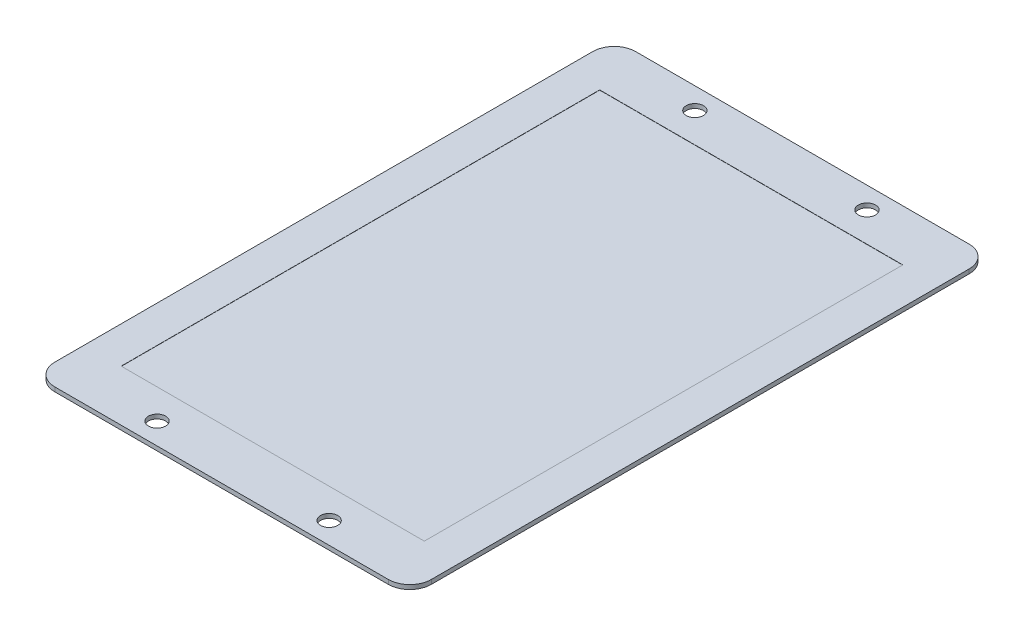
ISO-10303-21;
HEADER;
FILE_DESCRIPTION(('STEP AP214'),'2;1');
FILE_NAME('part.step','',(''),(''),'','','');
FILE_SCHEMA(('AUTOMOTIVE_DESIGN { 1 0 10303 214 1 1 1 1 }'));
ENDSEC;
DATA;
#1=APPLICATION_CONTEXT('core data for automotive mechanical design processes');
#2=APPLICATION_PROTOCOL_DEFINITION('international standard','automotive_design',2000,#1);
#3=PRODUCT_CONTEXT('',#1,'mechanical');
#4=PRODUCT('Part','Part','',(#3));
#5=PRODUCT_RELATED_PRODUCT_CATEGORY('part','',(#4));
#6=PRODUCT_DEFINITION_FORMATION('','',#4);
#7=PRODUCT_DEFINITION_CONTEXT('part definition',#1,'design');
#8=PRODUCT_DEFINITION('design','',#6,#7);
#9=PRODUCT_DEFINITION_SHAPE('','',#8);
#10=(LENGTH_UNIT() NAMED_UNIT(*) SI_UNIT(.MILLI.,.METRE.));
#11=(NAMED_UNIT(*) PLANE_ANGLE_UNIT() SI_UNIT($,.RADIAN.));
#12=(NAMED_UNIT(*) SI_UNIT($,.STERADIAN.) SOLID_ANGLE_UNIT());
#13=UNCERTAINTY_MEASURE_WITH_UNIT(LENGTH_MEASURE(1.E-05),#10,'distance_accuracy_value','');
#14=(GEOMETRIC_REPRESENTATION_CONTEXT(3) GLOBAL_UNCERTAINTY_ASSIGNED_CONTEXT((#13)) GLOBAL_UNIT_ASSIGNED_CONTEXT((#10,
#11,#12)) REPRESENTATION_CONTEXT('',''));
#15=CARTESIAN_POINT('',(0.,0.,0.));
#16=DIRECTION('',(0.,0.,1.));
#17=DIRECTION('',(1.,0.,0.));
#18=AXIS2_PLACEMENT_3D('',#15,#16,#17);
#19=CARTESIAN_POINT('',(0.,0.,0.));
#20=DIRECTION('',(0.,1.,0.));
#21=DIRECTION('',(0.,0.,1.));
#22=AXIS2_PLACEMENT_3D('',#19,#20,#21);
#23=PLANE('',#22);
#24=DIRECTION('',(0.,0.,-1.));
#25=VECTOR('',#24,1.);
#26=CARTESIAN_POINT('',(87.5,0.,-135.));
#27=LINE('',#26,#25);
#28=CARTESIAN_POINT('',(87.5,0.,125.));
#29=VERTEX_POINT('',#28);
#30=CARTESIAN_POINT('',(87.5,0.,-125.));
#31=VERTEX_POINT('',#30);
#32=EDGE_CURVE('E257',#29,#31,#27,.T.);
#33=ORIENTED_EDGE('',*,*,#32,.F.);
#34=CARTESIAN_POINT('',(77.5,0.,125.));
#35=DIRECTION('',(0.,1.,0.));
#36=DIRECTION('',(0.,0.,1.));
#37=AXIS2_PLACEMENT_3D('',#34,#35,#36);
#38=CIRCLE('',#37,10.);
#39=CARTESIAN_POINT('',(77.5,0.,135.));
#40=VERTEX_POINT('',#39);
#41=EDGE_CURVE('E294',#29,#40,#38,.F.);
#42=ORIENTED_EDGE('',*,*,#41,.T.);
#43=DIRECTION('',(1.,0.,0.));
#44=VECTOR('',#43,1.);
#45=CARTESIAN_POINT('',(-87.5,0.,135.));
#46=LINE('',#45,#44);
#47=CARTESIAN_POINT('',(-77.5,0.,135.));
#48=VERTEX_POINT('',#47);
#49=EDGE_CURVE('E264',#48,#40,#46,.T.);
#50=ORIENTED_EDGE('',*,*,#49,.F.);
#51=CARTESIAN_POINT('',(-77.5,0.,125.));
#52=DIRECTION('',(0.,1.,0.));
#53=DIRECTION('',(0.,0.,1.));
#54=AXIS2_PLACEMENT_3D('',#51,#52,#53);
#55=CIRCLE('',#54,10.);
#56=CARTESIAN_POINT('',(-87.5,0.,125.));
#57=VERTEX_POINT('',#56);
#58=EDGE_CURVE('E288',#48,#57,#55,.F.);
#59=ORIENTED_EDGE('',*,*,#58,.T.);
#60=DIRECTION('',(0.,0.,1.));
#61=VECTOR('',#60,1.);
#62=CARTESIAN_POINT('',(-87.5,0.,-135.));
#63=LINE('',#62,#61);
#64=CARTESIAN_POINT('',(-87.5,0.,-125.));
#65=VERTEX_POINT('',#64);
#66=EDGE_CURVE('E279',#65,#57,#63,.T.);
#67=ORIENTED_EDGE('',*,*,#66,.F.);
#68=CARTESIAN_POINT('',(-77.5,0.,-125.));
#69=DIRECTION('',(0.,1.,0.));
#70=DIRECTION('',(0.,0.,1.));
#71=AXIS2_PLACEMENT_3D('',#68,#69,#70);
#72=CIRCLE('',#71,10.);
#73=CARTESIAN_POINT('',(-77.5,0.,-135.));
#74=VERTEX_POINT('',#73);
#75=EDGE_CURVE('E292',#65,#74,#72,.F.);
#76=ORIENTED_EDGE('',*,*,#75,.T.);
#77=DIRECTION('',(-1.,0.,0.));
#78=VECTOR('',#77,1.);
#79=CARTESIAN_POINT('',(-87.5,0.,-135.));
#80=LINE('',#79,#78);
#81=CARTESIAN_POINT('',(77.5,0.,-135.));
#82=VERTEX_POINT('',#81);
#83=EDGE_CURVE('E276',#82,#74,#80,.T.);
#84=ORIENTED_EDGE('',*,*,#83,.F.);
#85=CARTESIAN_POINT('',(77.5,0.,-125.));
#86=DIRECTION('',(0.,1.,0.));
#87=DIRECTION('',(0.,0.,1.));
#88=AXIS2_PLACEMENT_3D('',#85,#86,#87);
#89=CIRCLE('',#88,10.);
#90=EDGE_CURVE('E290',#82,#31,#89,.F.);
#91=ORIENTED_EDGE('',*,*,#90,.T.);
#92=EDGE_LOOP('',(#33,#42,#50,#59,#67,#76,#84,#91));
#93=FACE_BOUND('',#92,.T.);
#94=CARTESIAN_POINT('',(-40.,0.,-125.));
#95=DIRECTION('',(0.,1.,0.));
#96=DIRECTION('',(0.,0.,1.));
#97=AXIS2_PLACEMENT_3D('',#94,#95,#96);
#98=CIRCLE('',#97,4.);
#99=CARTESIAN_POINT('',(-40.,0.,-121.));
#100=VERTEX_POINT('',#99);
#101=EDGE_CURVE('E254',#100,#100,#98,.T.);
#102=ORIENTED_EDGE('',*,*,#101,.T.);
#103=EDGE_LOOP('',(#102));
#104=FACE_BOUND('',#103,.T.);
#105=CARTESIAN_POINT('',(40.,0.,-125.));
#106=DIRECTION('',(0.,1.,0.));
#107=DIRECTION('',(0.,0.,1.));
#108=AXIS2_PLACEMENT_3D('',#105,#106,#107);
#109=CIRCLE('',#108,4.);
#110=CARTESIAN_POINT('',(40.,0.,-121.));
#111=VERTEX_POINT('',#110);
#112=EDGE_CURVE('E236',#111,#111,#109,.T.);
#113=ORIENTED_EDGE('',*,*,#112,.T.);
#114=EDGE_LOOP('',(#113));
#115=FACE_BOUND('',#114,.T.);
#116=CARTESIAN_POINT('',(40.,0.,125.));
#117=DIRECTION('',(0.,1.,0.));
#118=DIRECTION('',(0.,0.,1.));
#119=AXIS2_PLACEMENT_3D('',#116,#117,#118);
#120=CIRCLE('',#119,4.00000000000001);
#121=CARTESIAN_POINT('',(40.,0.,129.));
#122=VERTEX_POINT('',#121);
#123=EDGE_CURVE('E243',#122,#122,#120,.T.);
#124=ORIENTED_EDGE('',*,*,#123,.T.);
#125=EDGE_LOOP('',(#124));
#126=FACE_BOUND('',#125,.T.);
#127=CARTESIAN_POINT('',(-40.,0.,125.));
#128=DIRECTION('',(0.,1.,0.));
#129=DIRECTION('',(0.,0.,1.));
#130=AXIS2_PLACEMENT_3D('',#127,#128,#129);
#131=CIRCLE('',#130,4.);
#132=CARTESIAN_POINT('',(-40.,0.,129.));
#133=VERTEX_POINT('',#132);
#134=EDGE_CURVE('E249',#133,#133,#131,.T.);
#135=ORIENTED_EDGE('',*,*,#134,.T.);
#136=EDGE_LOOP('',(#135));
#137=FACE_BOUND('',#136,.T.);
#138=DIRECTION('',(0.,0.,-1.));
#139=VECTOR('',#138,1.);
#140=CARTESIAN_POINT('',(-2.5,0.,-20.));
#141=LINE('',#140,#139);
#142=CARTESIAN_POINT('',(-2.5,0.,18.));
#143=VERTEX_POINT('',#142);
#144=CARTESIAN_POINT('',(-2.5,0.,-18.));
#145=VERTEX_POINT('',#144);
#146=EDGE_CURVE('E389',#143,#145,#141,.T.);
#147=ORIENTED_EDGE('',*,*,#146,.F.);
#148=CARTESIAN_POINT('',(-0.500000000000002,0.,18.));
#149=DIRECTION('',(0.,1.,0.));
#150=DIRECTION('',(0.,0.,1.));
#151=AXIS2_PLACEMENT_3D('',#148,#149,#150);
#152=CIRCLE('',#151,2.);
#153=CARTESIAN_POINT('',(-0.499999999999987,0.,20.));
#154=VERTEX_POINT('',#153);
#155=EDGE_CURVE('E353',#143,#154,#152,.T.);
#156=ORIENTED_EDGE('',*,*,#155,.T.);
#157=DIRECTION('',(-1.,0.,0.));
#158=VECTOR('',#157,1.);
#159=CARTESIAN_POINT('',(42.5,0.,20.));
#160=LINE('',#159,#158);
#161=CARTESIAN_POINT('',(40.5,0.,20.));
#162=VERTEX_POINT('',#161);
#163=EDGE_CURVE('E220',#162,#154,#160,.T.);
#164=ORIENTED_EDGE('',*,*,#163,.F.);
#165=CARTESIAN_POINT('',(40.5,0.,18.));
#166=DIRECTION('',(0.,1.,0.));
#167=DIRECTION('',(0.,0.,1.));
#168=AXIS2_PLACEMENT_3D('',#165,#166,#167);
#169=CIRCLE('',#168,2.);
#170=CARTESIAN_POINT('',(42.5,0.,18.));
#171=VERTEX_POINT('',#170);
#172=EDGE_CURVE('E351',#162,#171,#169,.T.);
#173=ORIENTED_EDGE('',*,*,#172,.T.);
#174=DIRECTION('',(0.,0.,1.));
#175=VECTOR('',#174,1.);
#176=CARTESIAN_POINT('',(42.5,0.,-20.));
#177=LINE('',#176,#175);
#178=CARTESIAN_POINT('',(42.5,0.,-18.));
#179=VERTEX_POINT('',#178);
#180=EDGE_CURVE('E395',#179,#171,#177,.T.);
#181=ORIENTED_EDGE('',*,*,#180,.F.);
#182=CARTESIAN_POINT('',(40.5,0.,-18.));
#183=DIRECTION('',(0.,1.,0.));
#184=DIRECTION('',(0.,0.,1.));
#185=AXIS2_PLACEMENT_3D('',#182,#183,#184);
#186=CIRCLE('',#185,2.);
#187=CARTESIAN_POINT('',(40.5,0.,-20.));
#188=VERTEX_POINT('',#187);
#189=EDGE_CURVE('E49',#179,#188,#186,.T.);
#190=ORIENTED_EDGE('',*,*,#189,.T.);
#191=DIRECTION('',(1.,0.,0.));
#192=VECTOR('',#191,1.);
#193=CARTESIAN_POINT('',(42.5,0.,-20.));
#194=LINE('',#193,#192);
#195=CARTESIAN_POINT('',(-0.499999999999987,0.,-20.));
#196=VERTEX_POINT('',#195);
#197=EDGE_CURVE('E391',#196,#188,#194,.T.);
#198=ORIENTED_EDGE('',*,*,#197,.F.);
#199=CARTESIAN_POINT('',(-0.5,0.,-18.));
#200=DIRECTION('',(0.,1.,0.));
#201=DIRECTION('',(0.,0.,1.));
#202=AXIS2_PLACEMENT_3D('',#199,#200,#201);
#203=CIRCLE('',#202,2.);
#204=EDGE_CURVE('E11',#196,#145,#203,.T.);
#205=ORIENTED_EDGE('',*,*,#204,.T.);
#206=EDGE_LOOP('',(#147,#156,#164,#173,#181,#190,#198,#205));
#207=FACE_BOUND('',#206,.T.);
#208=ADVANCED_FACE('F40',(#93,#104,#115,#126,#137,#207),#23,.F.);
#209=CARTESIAN_POINT('',(87.5,2.,-135.));
#210=DIRECTION('',(-1.,0.,0.));
#211=DIRECTION('',(0.,0.,1.));
#212=AXIS2_PLACEMENT_3D('',#209,#210,#211);
#213=PLANE('',#212);
#214=DIRECTION('',(0.,0.,-1.));
#215=VECTOR('',#214,1.);
#216=CARTESIAN_POINT('',(87.5,2.,-135.));
#217=LINE('',#216,#215);
#218=CARTESIAN_POINT('',(87.5,2.,125.));
#219=VERTEX_POINT('',#218);
#220=CARTESIAN_POINT('',(87.5,2.,-125.));
#221=VERTEX_POINT('',#220);
#222=EDGE_CURVE('E260',#219,#221,#217,.T.);
#223=ORIENTED_EDGE('',*,*,#222,.F.);
#224=DIRECTION('',(0.,-1.,0.));
#225=VECTOR('',#224,1.);
#226=CARTESIAN_POINT('',(87.5,2.,125.));
#227=LINE('',#226,#225);
#228=EDGE_CURVE('E285',#219,#29,#227,.T.);
#229=ORIENTED_EDGE('',*,*,#228,.T.);
#230=ORIENTED_EDGE('',*,*,#32,.T.);
#231=DIRECTION('',(0.,-1.,0.));
#232=VECTOR('',#231,1.);
#233=CARTESIAN_POINT('',(87.5,2.,-125.));
#234=LINE('',#233,#232);
#235=EDGE_CURVE('E273',#31,#221,#234,.F.);
#236=ORIENTED_EDGE('',*,*,#235,.T.);
#237=EDGE_LOOP('',(#223,#229,#230,#236));
#238=FACE_BOUND('',#237,.T.);
#239=ADVANCED_FACE('F465',(#238),#213,.F.);
#240=CARTESIAN_POINT('',(-87.5,2.,-135.));
#241=DIRECTION('',(0.,0.,1.));
#242=DIRECTION('',(1.,0.,0.));
#243=AXIS2_PLACEMENT_3D('',#240,#241,#242);
#244=PLANE('',#243);
#245=ORIENTED_EDGE('',*,*,#83,.T.);
#246=DIRECTION('',(0.,-1.,0.));
#247=VECTOR('',#246,1.);
#248=CARTESIAN_POINT('',(-77.5,2.,-135.));
#249=LINE('',#248,#247);
#250=CARTESIAN_POINT('',(-77.5,2.,-135.));
#251=VERTEX_POINT('',#250);
#252=EDGE_CURVE('E317',#74,#251,#249,.F.);
#253=ORIENTED_EDGE('',*,*,#252,.T.);
#254=DIRECTION('',(-1.,0.,0.));
#255=VECTOR('',#254,1.);
#256=CARTESIAN_POINT('',(-87.5,2.,-135.));
#257=LINE('',#256,#255);
#258=CARTESIAN_POINT('',(77.5,2.,-135.));
#259=VERTEX_POINT('',#258);
#260=EDGE_CURVE('E263',#259,#251,#257,.T.);
#261=ORIENTED_EDGE('',*,*,#260,.F.);
#262=DIRECTION('',(0.,-1.,0.));
#263=VECTOR('',#262,1.);
#264=CARTESIAN_POINT('',(77.5,2.,-135.));
#265=LINE('',#264,#263);
#266=EDGE_CURVE('E314',#259,#82,#265,.T.);
#267=ORIENTED_EDGE('',*,*,#266,.T.);
#268=EDGE_LOOP('',(#245,#253,#261,#267));
#269=FACE_BOUND('',#268,.T.);
#270=ADVANCED_FACE('F471',(#269),#244,.F.);
#271=CARTESIAN_POINT('',(-87.5,2.,-135.));
#272=DIRECTION('',(1.,0.,0.));
#273=DIRECTION('',(0.,0.,-1.));
#274=AXIS2_PLACEMENT_3D('',#271,#272,#273);
#275=PLANE('',#274);
#276=DIRECTION('',(0.,0.,1.));
#277=VECTOR('',#276,1.);
#278=CARTESIAN_POINT('',(-87.5,2.,-135.));
#279=LINE('',#278,#277);
#280=CARTESIAN_POINT('',(-87.5,2.,-125.));
#281=VERTEX_POINT('',#280);
#282=CARTESIAN_POINT('',(-87.5,2.,125.));
#283=VERTEX_POINT('',#282);
#284=EDGE_CURVE('E267',#281,#283,#279,.T.);
#285=ORIENTED_EDGE('',*,*,#284,.F.);
#286=DIRECTION('',(0.,-1.,0.));
#287=VECTOR('',#286,1.);
#288=CARTESIAN_POINT('',(-87.5,2.,-125.));
#289=LINE('',#288,#287);
#290=EDGE_CURVE('E311',#281,#65,#289,.T.);
#291=ORIENTED_EDGE('',*,*,#290,.T.);
#292=ORIENTED_EDGE('',*,*,#66,.T.);
#293=DIRECTION('',(0.,-1.,0.));
#294=VECTOR('',#293,1.);
#295=CARTESIAN_POINT('',(-87.5,2.,125.));
#296=LINE('',#295,#294);
#297=EDGE_CURVE('E309',#57,#283,#296,.F.);
#298=ORIENTED_EDGE('',*,*,#297,.T.);
#299=EDGE_LOOP('',(#285,#291,#292,#298));
#300=FACE_BOUND('',#299,.T.);
#301=ADVANCED_FACE('F483',(#300),#275,.F.);
#302=CARTESIAN_POINT('',(-87.5,2.,135.));
#303=DIRECTION('',(0.,0.,-1.));
#304=DIRECTION('',(-1.,0.,0.));
#305=AXIS2_PLACEMENT_3D('',#302,#303,#304);
#306=PLANE('',#305);
#307=ORIENTED_EDGE('',*,*,#49,.T.);
#308=DIRECTION('',(0.,-1.,0.));
#309=VECTOR('',#308,1.);
#310=CARTESIAN_POINT('',(77.5,2.,135.));
#311=LINE('',#310,#309);
#312=CARTESIAN_POINT('',(77.5,2.,135.));
#313=VERTEX_POINT('',#312);
#314=EDGE_CURVE('E299',#40,#313,#311,.F.);
#315=ORIENTED_EDGE('',*,*,#314,.T.);
#316=DIRECTION('',(1.,0.,0.));
#317=VECTOR('',#316,1.);
#318=CARTESIAN_POINT('',(-87.5,2.,135.));
#319=LINE('',#318,#317);
#320=CARTESIAN_POINT('',(-77.5,2.,135.));
#321=VERTEX_POINT('',#320);
#322=EDGE_CURVE('E270',#321,#313,#319,.T.);
#323=ORIENTED_EDGE('',*,*,#322,.F.);
#324=DIRECTION('',(0.,-1.,0.));
#325=VECTOR('',#324,1.);
#326=CARTESIAN_POINT('',(-77.5,2.,135.));
#327=LINE('',#326,#325);
#328=EDGE_CURVE('E296',#321,#48,#327,.T.);
#329=ORIENTED_EDGE('',*,*,#328,.T.);
#330=EDGE_LOOP('',(#307,#315,#323,#329));
#331=FACE_BOUND('',#330,.T.);
#332=ADVANCED_FACE('F480',(#331),#306,.F.);
#333=CARTESIAN_POINT('',(0.,2.,0.));
#334=DIRECTION('',(0.,1.,0.));
#335=DIRECTION('',(0.,0.,1.));
#336=AXIS2_PLACEMENT_3D('',#333,#334,#335);
#337=PLANE('',#336);
#338=DIRECTION('',(0.,0.,-1.));
#339=VECTOR('',#338,1.);
#340=CARTESIAN_POINT('',(70.4533735657283,2.,-111.208912534244));
#341=LINE('',#340,#339);
#342=CARTESIAN_POINT('',(70.4533735657283,2.,111.208912534244));
#343=VERTEX_POINT('',#342);
#344=CARTESIAN_POINT('',(70.4533735657283,2.,-111.208912534244));
#345=VERTEX_POINT('',#344);
#346=EDGE_CURVE('E197',#343,#345,#341,.T.);
#347=ORIENTED_EDGE('',*,*,#346,.F.);
#348=DIRECTION('',(1.,0.,0.));
#349=VECTOR('',#348,1.);
#350=CARTESIAN_POINT('',(-70.4533735657283,2.,111.208912534244));
#351=LINE('',#350,#349);
#352=CARTESIAN_POINT('',(-70.4533735657283,2.,111.208912534244));
#353=VERTEX_POINT('',#352);
#354=EDGE_CURVE('E214',#353,#343,#351,.T.);
#355=ORIENTED_EDGE('',*,*,#354,.F.);
#356=DIRECTION('',(0.,0.,1.));
#357=VECTOR('',#356,1.);
#358=CARTESIAN_POINT('',(-70.4533735657283,2.,-111.208912534244));
#359=LINE('',#358,#357);
#360=CARTESIAN_POINT('',(-70.4533735657283,2.,-111.208912534244));
#361=VERTEX_POINT('',#360);
#362=EDGE_CURVE('E217',#361,#353,#359,.T.);
#363=ORIENTED_EDGE('',*,*,#362,.F.);
#364=DIRECTION('',(-1.,0.,0.));
#365=VECTOR('',#364,1.);
#366=CARTESIAN_POINT('',(-70.4533735657283,2.,-111.208912534244));
#367=LINE('',#366,#365);
#368=EDGE_CURVE('E226',#345,#361,#367,.T.);
#369=ORIENTED_EDGE('',*,*,#368,.F.);
#370=EDGE_LOOP('',(#347,#355,#363,#369));
#371=FACE_BOUND('',#370,.T.);
#372=CARTESIAN_POINT('',(-40.,2.,125.));
#373=DIRECTION('',(0.,1.,0.));
#374=DIRECTION('',(0.,0.,1.));
#375=AXIS2_PLACEMENT_3D('',#372,#373,#374);
#376=CIRCLE('',#375,4.);
#377=CARTESIAN_POINT('',(-40.,2.,129.));
#378=VERTEX_POINT('',#377);
#379=EDGE_CURVE('E232',#378,#378,#376,.T.);
#380=ORIENTED_EDGE('',*,*,#379,.F.);
#381=EDGE_LOOP('',(#380));
#382=FACE_BOUND('',#381,.T.);
#383=CARTESIAN_POINT('',(40.,2.,125.));
#384=DIRECTION('',(0.,1.,0.));
#385=DIRECTION('',(0.,0.,1.));
#386=AXIS2_PLACEMENT_3D('',#383,#384,#385);
#387=CIRCLE('',#386,4.00000000000001);
#388=CARTESIAN_POINT('',(40.,2.,129.));
#389=VERTEX_POINT('',#388);
#390=EDGE_CURVE('E246',#389,#389,#387,.T.);
#391=ORIENTED_EDGE('',*,*,#390,.F.);
#392=EDGE_LOOP('',(#391));
#393=FACE_BOUND('',#392,.T.);
#394=CARTESIAN_POINT('',(40.,2.,-125.));
#395=DIRECTION('',(0.,1.,0.));
#396=DIRECTION('',(0.,0.,1.));
#397=AXIS2_PLACEMENT_3D('',#394,#395,#396);
#398=CIRCLE('',#397,4.);
#399=CARTESIAN_POINT('',(40.,2.,-121.));
#400=VERTEX_POINT('',#399);
#401=EDGE_CURVE('E240',#400,#400,#398,.T.);
#402=ORIENTED_EDGE('',*,*,#401,.F.);
#403=EDGE_LOOP('',(#402));
#404=FACE_BOUND('',#403,.T.);
#405=CARTESIAN_POINT('',(-40.,2.,-125.));
#406=DIRECTION('',(0.,1.,0.));
#407=DIRECTION('',(0.,0.,1.));
#408=AXIS2_PLACEMENT_3D('',#405,#406,#407);
#409=CIRCLE('',#408,4.);
#410=CARTESIAN_POINT('',(-40.,2.,-121.));
#411=VERTEX_POINT('',#410);
#412=EDGE_CURVE('E239',#411,#411,#409,.T.);
#413=ORIENTED_EDGE('',*,*,#412,.F.);
#414=EDGE_LOOP('',(#413));
#415=FACE_BOUND('',#414,.T.);
#416=ORIENTED_EDGE('',*,*,#322,.T.);
#417=CARTESIAN_POINT('',(77.5,2.,125.));
#418=DIRECTION('',(0.,1.,0.));
#419=DIRECTION('',(0.,0.,1.));
#420=AXIS2_PLACEMENT_3D('',#417,#418,#419);
#421=CIRCLE('',#420,10.);
#422=EDGE_CURVE('E307',#313,#219,#421,.T.);
#423=ORIENTED_EDGE('',*,*,#422,.T.);
#424=ORIENTED_EDGE('',*,*,#222,.T.);
#425=CARTESIAN_POINT('',(77.5,2.,-125.));
#426=DIRECTION('',(0.,1.,0.));
#427=DIRECTION('',(0.,0.,1.));
#428=AXIS2_PLACEMENT_3D('',#425,#426,#427);
#429=CIRCLE('',#428,10.);
#430=EDGE_CURVE('E303',#221,#259,#429,.T.);
#431=ORIENTED_EDGE('',*,*,#430,.T.);
#432=ORIENTED_EDGE('',*,*,#260,.T.);
#433=CARTESIAN_POINT('',(-77.5,2.,-125.));
#434=DIRECTION('',(0.,1.,0.));
#435=DIRECTION('',(0.,0.,1.));
#436=AXIS2_PLACEMENT_3D('',#433,#434,#435);
#437=CIRCLE('',#436,10.);
#438=EDGE_CURVE('E305',#251,#281,#437,.T.);
#439=ORIENTED_EDGE('',*,*,#438,.T.);
#440=ORIENTED_EDGE('',*,*,#284,.T.);
#441=CARTESIAN_POINT('',(-77.5,2.,125.));
#442=DIRECTION('',(0.,1.,0.));
#443=DIRECTION('',(0.,0.,1.));
#444=AXIS2_PLACEMENT_3D('',#441,#442,#443);
#445=CIRCLE('',#444,10.);
#446=EDGE_CURVE('E301',#283,#321,#445,.T.);
#447=ORIENTED_EDGE('',*,*,#446,.T.);
#448=EDGE_LOOP('',(#416,#423,#424,#431,#432,#439,#440,#447));
#449=FACE_BOUND('',#448,.T.);
#450=ADVANCED_FACE('F478',(#371,#382,#393,#404,#415,#449),#337,.T.);
#451=CARTESIAN_POINT('',(77.5,2.,125.));
#452=DIRECTION('',(0.,-1.,0.));
#453=DIRECTION('',(0.,0.,-1.));
#454=AXIS2_PLACEMENT_3D('',#451,#452,#453);
#455=CYLINDRICAL_SURFACE('',#454,10.);
#456=ORIENTED_EDGE('',*,*,#422,.F.);
#457=ORIENTED_EDGE('',*,*,#314,.F.);
#458=ORIENTED_EDGE('',*,*,#41,.F.);
#459=ORIENTED_EDGE('',*,*,#228,.F.);
#460=EDGE_LOOP('',(#456,#457,#458,#459));
#461=FACE_BOUND('',#460,.T.);
#462=ADVANCED_FACE('F491',(#461),#455,.T.);
#463=CARTESIAN_POINT('',(-77.5,2.,-125.));
#464=DIRECTION('',(0.,-1.,0.));
#465=DIRECTION('',(0.,0.,-1.));
#466=AXIS2_PLACEMENT_3D('',#463,#464,#465);
#467=CYLINDRICAL_SURFACE('',#466,10.);
#468=ORIENTED_EDGE('',*,*,#438,.F.);
#469=ORIENTED_EDGE('',*,*,#252,.F.);
#470=ORIENTED_EDGE('',*,*,#75,.F.);
#471=ORIENTED_EDGE('',*,*,#290,.F.);
#472=EDGE_LOOP('',(#468,#469,#470,#471));
#473=FACE_BOUND('',#472,.T.);
#474=ADVANCED_FACE('F494',(#473),#467,.T.);
#475=CARTESIAN_POINT('',(77.5,2.,-125.));
#476=DIRECTION('',(0.,-1.,0.));
#477=DIRECTION('',(0.,0.,-1.));
#478=AXIS2_PLACEMENT_3D('',#475,#476,#477);
#479=CYLINDRICAL_SURFACE('',#478,10.);
#480=ORIENTED_EDGE('',*,*,#430,.F.);
#481=ORIENTED_EDGE('',*,*,#235,.F.);
#482=ORIENTED_EDGE('',*,*,#90,.F.);
#483=ORIENTED_EDGE('',*,*,#266,.F.);
#484=EDGE_LOOP('',(#480,#481,#482,#483));
#485=FACE_BOUND('',#484,.T.);
#486=ADVANCED_FACE('F498',(#485),#479,.T.);
#487=CARTESIAN_POINT('',(-77.5,2.,125.));
#488=DIRECTION('',(0.,-1.,0.));
#489=DIRECTION('',(0.,0.,-1.));
#490=AXIS2_PLACEMENT_3D('',#487,#488,#489);
#491=CYLINDRICAL_SURFACE('',#490,10.);
#492=ORIENTED_EDGE('',*,*,#446,.F.);
#493=ORIENTED_EDGE('',*,*,#297,.F.);
#494=ORIENTED_EDGE('',*,*,#58,.F.);
#495=ORIENTED_EDGE('',*,*,#328,.F.);
#496=EDGE_LOOP('',(#492,#493,#494,#495));
#497=FACE_BOUND('',#496,.T.);
#498=ADVANCED_FACE('F502',(#497),#491,.T.);
#499=CARTESIAN_POINT('',(-40.,0.,-125.));
#500=DIRECTION('',(0.,1.,0.));
#501=DIRECTION('',(0.,0.,1.));
#502=AXIS2_PLACEMENT_3D('',#499,#500,#501);
#503=CYLINDRICAL_SURFACE('',#502,4.);
#504=ORIENTED_EDGE('',*,*,#101,.F.);
#505=EDGE_LOOP('',(#504));
#506=FACE_BOUND('',#505,.T.);
#507=ORIENTED_EDGE('',*,*,#412,.T.);
#508=EDGE_LOOP('',(#507));
#509=FACE_BOUND('',#508,.T.);
#510=ADVANCED_FACE('F506',(#506,#509),#503,.F.);
#511=CARTESIAN_POINT('',(40.,0.,-125.));
#512=DIRECTION('',(0.,1.,0.));
#513=DIRECTION('',(0.,0.,1.));
#514=AXIS2_PLACEMENT_3D('',#511,#512,#513);
#515=CYLINDRICAL_SURFACE('',#514,4.);
#516=ORIENTED_EDGE('',*,*,#112,.F.);
#517=EDGE_LOOP('',(#516));
#518=FACE_BOUND('',#517,.T.);
#519=ORIENTED_EDGE('',*,*,#401,.T.);
#520=EDGE_LOOP('',(#519));
#521=FACE_BOUND('',#520,.T.);
#522=ADVANCED_FACE('F690',(#518,#521),#515,.F.);
#523=CARTESIAN_POINT('',(40.,0.,125.));
#524=DIRECTION('',(0.,1.,0.));
#525=DIRECTION('',(0.,0.,1.));
#526=AXIS2_PLACEMENT_3D('',#523,#524,#525);
#527=CYLINDRICAL_SURFACE('',#526,4.00000000000001);
#528=ORIENTED_EDGE('',*,*,#123,.F.);
#529=EDGE_LOOP('',(#528));
#530=FACE_BOUND('',#529,.T.);
#531=ORIENTED_EDGE('',*,*,#390,.T.);
#532=EDGE_LOOP('',(#531));
#533=FACE_BOUND('',#532,.T.);
#534=ADVANCED_FACE('F681',(#530,#533),#527,.F.);
#535=CARTESIAN_POINT('',(-40.,0.,125.));
#536=DIRECTION('',(0.,1.,0.));
#537=DIRECTION('',(0.,0.,1.));
#538=AXIS2_PLACEMENT_3D('',#535,#536,#537);
#539=CYLINDRICAL_SURFACE('',#538,4.);
#540=ORIENTED_EDGE('',*,*,#134,.F.);
#541=EDGE_LOOP('',(#540));
#542=FACE_BOUND('',#541,.T.);
#543=ORIENTED_EDGE('',*,*,#379,.T.);
#544=EDGE_LOOP('',(#543));
#545=FACE_BOUND('',#544,.T.);
#546=ADVANCED_FACE('F672',(#542,#545),#539,.F.);
#547=CARTESIAN_POINT('',(70.4533735657283,1.9,-111.208912534244));
#548=DIRECTION('',(1.,0.,0.));
#549=DIRECTION('',(0.,0.,-1.));
#550=AXIS2_PLACEMENT_3D('',#547,#548,#549);
#551=PLANE('',#550);
#552=ORIENTED_EDGE('',*,*,#346,.T.);
#553=DIRECTION('',(0.,1.,0.));
#554=VECTOR('',#553,1.);
#555=CARTESIAN_POINT('',(70.4533735657283,1.9,-111.208912534244));
#556=LINE('',#555,#554);
#557=CARTESIAN_POINT('',(70.4533735657283,1.9,-111.208912534244));
#558=VERTEX_POINT('',#557);
#559=EDGE_CURVE('E190',#558,#345,#556,.T.);
#560=ORIENTED_EDGE('',*,*,#559,.F.);
#561=DIRECTION('',(0.,0.,-1.));
#562=VECTOR('',#561,1.);
#563=CARTESIAN_POINT('',(70.4533735657283,1.9,-111.208912534244));
#564=LINE('',#563,#562);
#565=CARTESIAN_POINT('',(70.4533735657283,1.9,111.208912534244));
#566=VERTEX_POINT('',#565);
#567=EDGE_CURVE('E194',#566,#558,#564,.T.);
#568=ORIENTED_EDGE('',*,*,#567,.F.);
#569=DIRECTION('',(0.,1.,0.));
#570=VECTOR('',#569,1.);
#571=CARTESIAN_POINT('',(70.4533735657283,1.9,111.208912534244));
#572=LINE('',#571,#570);
#573=EDGE_CURVE('E230',#566,#343,#572,.T.);
#574=ORIENTED_EDGE('',*,*,#573,.T.);
#575=EDGE_LOOP('',(#552,#560,#568,#574));
#576=FACE_BOUND('',#575,.T.);
#577=ADVANCED_FACE('F192',(#576),#551,.F.);
#578=CARTESIAN_POINT('',(-70.4533735657283,1.9,111.208912534244));
#579=DIRECTION('',(0.,0.,1.));
#580=DIRECTION('',(1.,0.,0.));
#581=AXIS2_PLACEMENT_3D('',#578,#579,#580);
#582=PLANE('',#581);
#583=ORIENTED_EDGE('',*,*,#354,.T.);
#584=ORIENTED_EDGE('',*,*,#573,.F.);
#585=DIRECTION('',(1.,0.,0.));
#586=VECTOR('',#585,1.);
#587=CARTESIAN_POINT('',(-70.4533735657283,1.9,111.208912534244));
#588=LINE('',#587,#586);
#589=CARTESIAN_POINT('',(-70.4533735657283,1.9,111.208912534244));
#590=VERTEX_POINT('',#589);
#591=EDGE_CURVE('E202',#590,#566,#588,.T.);
#592=ORIENTED_EDGE('',*,*,#591,.F.);
#593=DIRECTION('',(0.,1.,0.));
#594=VECTOR('',#593,1.);
#595=CARTESIAN_POINT('',(-70.4533735657283,1.9,111.208912534244));
#596=LINE('',#595,#594);
#597=EDGE_CURVE('E233',#590,#353,#596,.T.);
#598=ORIENTED_EDGE('',*,*,#597,.T.);
#599=EDGE_LOOP('',(#583,#584,#592,#598));
#600=FACE_BOUND('',#599,.T.);
#601=ADVANCED_FACE('F655',(#600),#582,.F.);
#602=CARTESIAN_POINT('',(-70.4533735657283,1.9,-111.208912534244));
#603=DIRECTION('',(-1.,0.,0.));
#604=DIRECTION('',(0.,0.,1.));
#605=AXIS2_PLACEMENT_3D('',#602,#603,#604);
#606=PLANE('',#605);
#607=ORIENTED_EDGE('',*,*,#362,.T.);
#608=ORIENTED_EDGE('',*,*,#597,.F.);
#609=DIRECTION('',(0.,0.,1.));
#610=VECTOR('',#609,1.);
#611=CARTESIAN_POINT('',(-70.4533735657283,1.9,-111.208912534244));
#612=LINE('',#611,#610);
#613=CARTESIAN_POINT('',(-70.4533735657283,1.9,-111.208912534244));
#614=VERTEX_POINT('',#613);
#615=EDGE_CURVE('E210',#614,#590,#612,.T.);
#616=ORIENTED_EDGE('',*,*,#615,.F.);
#617=DIRECTION('',(0.,1.,0.));
#618=VECTOR('',#617,1.);
#619=CARTESIAN_POINT('',(-70.4533735657283,1.9,-111.208912534244));
#620=LINE('',#619,#618);
#621=EDGE_CURVE('E201',#614,#361,#620,.T.);
#622=ORIENTED_EDGE('',*,*,#621,.T.);
#623=EDGE_LOOP('',(#607,#608,#616,#622));
#624=FACE_BOUND('',#623,.T.);
#625=ADVANCED_FACE('F647',(#624),#606,.F.);
#626=CARTESIAN_POINT('',(-70.4533735657283,1.9,-111.208912534244));
#627=DIRECTION('',(0.,0.,-1.));
#628=DIRECTION('',(-1.,0.,0.));
#629=AXIS2_PLACEMENT_3D('',#626,#627,#628);
#630=PLANE('',#629);
#631=ORIENTED_EDGE('',*,*,#368,.T.);
#632=ORIENTED_EDGE('',*,*,#621,.F.);
#633=DIRECTION('',(-1.,0.,0.));
#634=VECTOR('',#633,1.);
#635=CARTESIAN_POINT('',(-70.4533735657283,1.9,-111.208912534244));
#636=LINE('',#635,#634);
#637=EDGE_CURVE('E205',#558,#614,#636,.T.);
#638=ORIENTED_EDGE('',*,*,#637,.F.);
#639=ORIENTED_EDGE('',*,*,#559,.T.);
#640=EDGE_LOOP('',(#631,#632,#638,#639));
#641=FACE_BOUND('',#640,.T.);
#642=ADVANCED_FACE('F206',(#641),#630,.F.);
#643=CARTESIAN_POINT('',(0.,1.9,0.));
#644=DIRECTION('',(0.,1.,0.));
#645=DIRECTION('',(0.,0.,1.));
#646=AXIS2_PLACEMENT_3D('',#643,#644,#645);
#647=PLANE('',#646);
#648=ORIENTED_EDGE('',*,*,#567,.T.);
#649=ORIENTED_EDGE('',*,*,#637,.T.);
#650=ORIENTED_EDGE('',*,*,#615,.T.);
#651=ORIENTED_EDGE('',*,*,#591,.T.);
#652=EDGE_LOOP('',(#648,#649,#650,#651));
#653=FACE_BOUND('',#652,.T.);
#654=ADVANCED_FACE('F212',(#653),#647,.T.);
#655=CARTESIAN_POINT('',(-2.5,-15.,-20.));
#656=DIRECTION('',(1.,0.,0.));
#657=DIRECTION('',(0.,0.,-1.));
#658=AXIS2_PLACEMENT_3D('',#655,#656,#657);
#659=PLANE('',#658);
#660=DIRECTION('',(0.,0.,-1.));
#661=VECTOR('',#660,1.);
#662=CARTESIAN_POINT('',(-2.5,-13.,20.));
#663=LINE('',#662,#661);
#664=CARTESIAN_POINT('',(-2.5,-13.,-18.));
#665=VERTEX_POINT('',#664);
#666=CARTESIAN_POINT('',(-2.5,-13.,18.));
#667=VERTEX_POINT('',#666);
#668=EDGE_CURVE('E57',#665,#667,#663,.F.);
#669=ORIENTED_EDGE('',*,*,#668,.T.);
#670=DIRECTION('',(0.,1.,0.));
#671=VECTOR('',#670,1.);
#672=CARTESIAN_POINT('',(-2.5,-15.,18.));
#673=LINE('',#672,#671);
#674=EDGE_CURVE('E349',#667,#143,#673,.T.);
#675=ORIENTED_EDGE('',*,*,#674,.T.);
#676=ORIENTED_EDGE('',*,*,#146,.T.);
#677=DIRECTION('',(0.,1.,0.));
#678=VECTOR('',#677,1.);
#679=CARTESIAN_POINT('',(-2.5,-15.,-18.));
#680=LINE('',#679,#678);
#681=EDGE_CURVE('E62',#145,#665,#680,.F.);
#682=ORIENTED_EDGE('',*,*,#681,.T.);
#683=EDGE_LOOP('',(#669,#675,#676,#682));
#684=FACE_BOUND('',#683,.T.);
#685=ADVANCED_FACE('F620',(#684),#659,.F.);
#686=CARTESIAN_POINT('',(42.5,-15.,-20.));
#687=DIRECTION('',(0.,0.,1.));
#688=DIRECTION('',(1.,0.,0.));
#689=AXIS2_PLACEMENT_3D('',#686,#687,#688);
#690=PLANE('',#689);
#691=ORIENTED_EDGE('',*,*,#197,.T.);
#692=DIRECTION('',(0.,1.,0.));
#693=VECTOR('',#692,1.);
#694=CARTESIAN_POINT('',(40.5,-15.,-20.));
#695=LINE('',#694,#693);
#696=CARTESIAN_POINT('',(40.5,-13.,-20.));
#697=VERTEX_POINT('',#696);
#698=EDGE_CURVE('E345',#188,#697,#695,.F.);
#699=ORIENTED_EDGE('',*,*,#698,.T.);
#700=DIRECTION('',(1.,0.,0.));
#701=VECTOR('',#700,1.);
#702=CARTESIAN_POINT('',(-2.5,-13.,-20.));
#703=LINE('',#702,#701);
#704=CARTESIAN_POINT('',(-0.5,-13.,-20.));
#705=VERTEX_POINT('',#704);
#706=EDGE_CURVE('E343',#697,#705,#703,.F.);
#707=ORIENTED_EDGE('',*,*,#706,.T.);
#708=DIRECTION('',(0.,1.,0.));
#709=VECTOR('',#708,1.);
#710=CARTESIAN_POINT('',(-0.5,-15.,-20.));
#711=LINE('',#710,#709);
#712=EDGE_CURVE('E341',#705,#196,#711,.T.);
#713=ORIENTED_EDGE('',*,*,#712,.T.);
#714=EDGE_LOOP('',(#691,#699,#707,#713));
#715=FACE_BOUND('',#714,.T.);
#716=ADVANCED_FACE('F446',(#715),#690,.F.);
#717=CARTESIAN_POINT('',(42.5,-15.,-20.));
#718=DIRECTION('',(-1.,0.,0.));
#719=DIRECTION('',(0.,0.,1.));
#720=AXIS2_PLACEMENT_3D('',#717,#718,#719);
#721=PLANE('',#720);
#722=ORIENTED_EDGE('',*,*,#180,.T.);
#723=DIRECTION('',(0.,1.,0.));
#724=VECTOR('',#723,1.);
#725=CARTESIAN_POINT('',(42.5,-15.,18.));
#726=LINE('',#725,#724);
#727=CARTESIAN_POINT('',(42.5,-13.,18.));
#728=VERTEX_POINT('',#727);
#729=EDGE_CURVE('E339',#171,#728,#726,.F.);
#730=ORIENTED_EDGE('',*,*,#729,.T.);
#731=DIRECTION('',(0.,0.,1.));
#732=VECTOR('',#731,1.);
#733=CARTESIAN_POINT('',(42.5,-13.,-20.));
#734=LINE('',#733,#732);
#735=CARTESIAN_POINT('',(42.5,-13.,-18.));
#736=VERTEX_POINT('',#735);
#737=EDGE_CURVE('E337',#728,#736,#734,.F.);
#738=ORIENTED_EDGE('',*,*,#737,.T.);
#739=DIRECTION('',(0.,1.,0.));
#740=VECTOR('',#739,1.);
#741=CARTESIAN_POINT('',(42.5,-15.,-18.));
#742=LINE('',#741,#740);
#743=EDGE_CURVE('E335',#736,#179,#742,.T.);
#744=ORIENTED_EDGE('',*,*,#743,.T.);
#745=EDGE_LOOP('',(#722,#730,#738,#744));
#746=FACE_BOUND('',#745,.T.);
#747=ADVANCED_FACE('F605',(#746),#721,.F.);
#748=CARTESIAN_POINT('',(42.5,-15.,20.));
#749=DIRECTION('',(0.,0.,-1.));
#750=DIRECTION('',(-1.,0.,0.));
#751=AXIS2_PLACEMENT_3D('',#748,#749,#750);
#752=PLANE('',#751);
#753=DIRECTION('',(-1.,0.,0.));
#754=VECTOR('',#753,1.);
#755=CARTESIAN_POINT('',(42.5,-13.,20.));
#756=LINE('',#755,#754);
#757=CARTESIAN_POINT('',(-0.500000000000003,-13.,20.));
#758=VERTEX_POINT('',#757);
#759=CARTESIAN_POINT('',(40.5,-13.,20.));
#760=VERTEX_POINT('',#759);
#761=EDGE_CURVE('E330',#758,#760,#756,.F.);
#762=ORIENTED_EDGE('',*,*,#761,.T.);
#763=DIRECTION('',(0.,1.,0.));
#764=VECTOR('',#763,1.);
#765=CARTESIAN_POINT('',(40.5,-15.,20.));
#766=LINE('',#765,#764);
#767=EDGE_CURVE('E333',#760,#162,#766,.T.);
#768=ORIENTED_EDGE('',*,*,#767,.T.);
#769=ORIENTED_EDGE('',*,*,#163,.T.);
#770=DIRECTION('',(0.,1.,0.));
#771=VECTOR('',#770,1.);
#772=CARTESIAN_POINT('',(-0.5,-15.,20.));
#773=LINE('',#772,#771);
#774=EDGE_CURVE('E328',#154,#758,#773,.F.);
#775=ORIENTED_EDGE('',*,*,#774,.T.);
#776=EDGE_LOOP('',(#762,#768,#769,#775));
#777=FACE_BOUND('',#776,.T.);
#778=ADVANCED_FACE('F405',(#777),#752,.F.);
#779=CARTESIAN_POINT('',(0.,-15.,0.));
#780=DIRECTION('',(0.,-1.,0.));
#781=DIRECTION('',(0.,0.,-1.));
#782=AXIS2_PLACEMENT_3D('',#779,#780,#781);
#783=PLANE('',#782);
#784=DIRECTION('',(0.,0.,1.));
#785=VECTOR('',#784,1.);
#786=CARTESIAN_POINT('',(40.5,-15.,20.));
#787=LINE('',#786,#785);
#788=CARTESIAN_POINT('',(40.5,-15.,-18.));
#789=VERTEX_POINT('',#788);
#790=CARTESIAN_POINT('',(40.5,-15.,18.));
#791=VERTEX_POINT('',#790);
#792=EDGE_CURVE('E323',#789,#791,#787,.T.);
#793=ORIENTED_EDGE('',*,*,#792,.T.);
#794=DIRECTION('',(-1.,0.,0.));
#795=VECTOR('',#794,1.);
#796=CARTESIAN_POINT('',(-2.5,-15.,18.));
#797=LINE('',#796,#795);
#798=CARTESIAN_POINT('',(-0.500000000000002,-15.,18.));
#799=VERTEX_POINT('',#798);
#800=EDGE_CURVE('E325',#791,#799,#797,.T.);
#801=ORIENTED_EDGE('',*,*,#800,.T.);
#802=DIRECTION('',(0.,0.,-1.));
#803=VECTOR('',#802,1.);
#804=CARTESIAN_POINT('',(-0.500000000000002,-15.,-20.));
#805=LINE('',#804,#803);
#806=CARTESIAN_POINT('',(-0.500000000000002,-15.,-18.));
#807=VERTEX_POINT('',#806);
#808=EDGE_CURVE('E319',#799,#807,#805,.T.);
#809=ORIENTED_EDGE('',*,*,#808,.T.);
#810=DIRECTION('',(1.,0.,0.));
#811=VECTOR('',#810,1.);
#812=CARTESIAN_POINT('',(42.5,-15.,-18.));
#813=LINE('',#812,#811);
#814=EDGE_CURVE('E321',#807,#789,#813,.T.);
#815=ORIENTED_EDGE('',*,*,#814,.T.);
#816=EDGE_LOOP('',(#793,#801,#809,#815));
#817=FACE_BOUND('',#816,.T.);
#818=ADVANCED_FACE('F428',(#817),#783,.T.);
#819=CARTESIAN_POINT('',(40.5,-15.,-18.));
#820=DIRECTION('',(0.,1.,0.));
#821=DIRECTION('',(0.,0.,1.));
#822=AXIS2_PLACEMENT_3D('',#819,#820,#821);
#823=CYLINDRICAL_SURFACE('',#822,2.);
#824=ORIENTED_EDGE('',*,*,#189,.F.);
#825=ORIENTED_EDGE('',*,*,#743,.F.);
#826=CARTESIAN_POINT('',(40.5,-13.,-18.));
#827=DIRECTION('',(0.,-1.,0.));
#828=DIRECTION('',(0.,0.,-1.));
#829=AXIS2_PLACEMENT_3D('',#826,#827,#828);
#830=CIRCLE('',#829,2.);
#831=EDGE_CURVE('E44',#697,#736,#830,.T.);
#832=ORIENTED_EDGE('',*,*,#831,.F.);
#833=ORIENTED_EDGE('',*,*,#698,.F.);
#834=EDGE_LOOP('',(#824,#825,#832,#833));
#835=FACE_BOUND('',#834,.T.);
#836=ADVANCED_FACE('F42',(#835),#823,.T.);
#837=CARTESIAN_POINT('',(0.,-13.,-18.));
#838=DIRECTION('',(-1.,0.,0.));
#839=DIRECTION('',(0.,0.,1.));
#840=AXIS2_PLACEMENT_3D('',#837,#838,#839);
#841=CYLINDRICAL_SURFACE('',#840,2.);
#842=CARTESIAN_POINT('',(-0.5,-13.,-18.));
#843=DIRECTION('',(-1.,0.,0.));
#844=DIRECTION('',(0.,-1.,0.));
#845=AXIS2_PLACEMENT_3D('',#842,#843,#844);
#846=CIRCLE('',#845,2.);
#847=EDGE_CURVE('E381',#705,#807,#846,.T.);
#848=ORIENTED_EDGE('',*,*,#847,.F.);
#849=ORIENTED_EDGE('',*,*,#706,.F.);
#850=CARTESIAN_POINT('',(40.5,-13.,-18.));
#851=DIRECTION('',(1.,0.,0.));
#852=DIRECTION('',(0.,0.,-1.));
#853=AXIS2_PLACEMENT_3D('',#850,#851,#852);
#854=CIRCLE('',#853,2.);
#855=EDGE_CURVE('E383',#789,#697,#854,.T.);
#856=ORIENTED_EDGE('',*,*,#855,.F.);
#857=ORIENTED_EDGE('',*,*,#814,.F.);
#858=EDGE_LOOP('',(#848,#849,#856,#857));
#859=FACE_BOUND('',#858,.T.);
#860=ADVANCED_FACE('F450',(#859),#841,.T.);
#861=CARTESIAN_POINT('',(-0.5,-15.,-18.));
#862=DIRECTION('',(0.,1.,0.));
#863=DIRECTION('',(0.,0.,1.));
#864=AXIS2_PLACEMENT_3D('',#861,#862,#863);
#865=CYLINDRICAL_SURFACE('',#864,2.);
#866=ORIENTED_EDGE('',*,*,#204,.F.);
#867=ORIENTED_EDGE('',*,*,#712,.F.);
#868=CARTESIAN_POINT('',(-0.500000000000002,-13.,-18.));
#869=DIRECTION('',(0.,-1.,0.));
#870=DIRECTION('',(0.,0.,-1.));
#871=AXIS2_PLACEMENT_3D('',#868,#869,#870);
#872=CIRCLE('',#871,2.);
#873=EDGE_CURVE('E378',#665,#705,#872,.T.);
#874=ORIENTED_EDGE('',*,*,#873,.F.);
#875=ORIENTED_EDGE('',*,*,#681,.F.);
#876=EDGE_LOOP('',(#866,#867,#874,#875));
#877=FACE_BOUND('',#876,.T.);
#878=ADVANCED_FACE('F455',(#877),#865,.T.);
#879=CARTESIAN_POINT('',(40.5,-13.,-18.));
#880=DIRECTION('',(0.,0.,-1.));
#881=DIRECTION('',(-1.,0.,0.));
#882=AXIS2_PLACEMENT_3D('',#879,#880,#881);
#883=SPHERICAL_SURFACE('',#882,2.);
#884=ORIENTED_EDGE('',*,*,#855,.T.);
#885=ORIENTED_EDGE('',*,*,#831,.T.);
#886=CARTESIAN_POINT('',(40.5,-13.,-18.));
#887=DIRECTION('',(0.,0.,-1.));
#888=DIRECTION('',(-1.,0.,0.));
#889=AXIS2_PLACEMENT_3D('',#886,#887,#888);
#890=CIRCLE('',#889,2.);
#891=EDGE_CURVE('E375',#789,#736,#890,.F.);
#892=ORIENTED_EDGE('',*,*,#891,.F.);
#893=EDGE_LOOP('',(#884,#885,#892));
#894=FACE_BOUND('',#893,.T.);
#895=ADVANCED_FACE('F457',(#894),#883,.T.);
#896=CARTESIAN_POINT('',(-0.500000000000002,-13.,-18.));
#897=DIRECTION('',(0.,0.,-1.));
#898=DIRECTION('',(-1.,0.,0.));
#899=AXIS2_PLACEMENT_3D('',#896,#897,#898);
#900=SPHERICAL_SURFACE('',#899,2.);
#901=ORIENTED_EDGE('',*,*,#873,.T.);
#902=ORIENTED_EDGE('',*,*,#847,.T.);
#903=CARTESIAN_POINT('',(-0.500000000000002,-13.,-18.));
#904=DIRECTION('',(0.,0.,-1.));
#905=DIRECTION('',(-1.,0.,0.));
#906=AXIS2_PLACEMENT_3D('',#903,#904,#905);
#907=CIRCLE('',#906,2.);
#908=EDGE_CURVE('E372',#665,#807,#907,.F.);
#909=ORIENTED_EDGE('',*,*,#908,.F.);
#910=EDGE_LOOP('',(#901,#902,#909));
#911=FACE_BOUND('',#910,.T.);
#912=ADVANCED_FACE('F452',(#911),#900,.T.);
#913=CARTESIAN_POINT('',(40.5,-15.,18.));
#914=DIRECTION('',(0.,1.,0.));
#915=DIRECTION('',(0.,0.,1.));
#916=AXIS2_PLACEMENT_3D('',#913,#914,#915);
#917=CYLINDRICAL_SURFACE('',#916,2.);
#918=ORIENTED_EDGE('',*,*,#172,.F.);
#919=ORIENTED_EDGE('',*,*,#767,.F.);
#920=CARTESIAN_POINT('',(40.5,-13.,18.));
#921=DIRECTION('',(0.,-1.,0.));
#922=DIRECTION('',(0.,0.,-1.));
#923=AXIS2_PLACEMENT_3D('',#920,#921,#922);
#924=CIRCLE('',#923,2.);
#925=EDGE_CURVE('E369',#728,#760,#924,.T.);
#926=ORIENTED_EDGE('',*,*,#925,.F.);
#927=ORIENTED_EDGE('',*,*,#729,.F.);
#928=EDGE_LOOP('',(#918,#919,#926,#927));
#929=FACE_BOUND('',#928,.T.);
#930=ADVANCED_FACE('F438',(#929),#917,.T.);
#931=CARTESIAN_POINT('',(40.5,-13.,0.));
#932=DIRECTION('',(0.,0.,-1.));
#933=DIRECTION('',(-1.,0.,0.));
#934=AXIS2_PLACEMENT_3D('',#931,#932,#933);
#935=CYLINDRICAL_SURFACE('',#934,2.);
#936=ORIENTED_EDGE('',*,*,#891,.T.);
#937=ORIENTED_EDGE('',*,*,#737,.F.);
#938=CARTESIAN_POINT('',(40.5,-13.,18.));
#939=DIRECTION('',(0.,0.,1.));
#940=DIRECTION('',(1.,0.,0.));
#941=AXIS2_PLACEMENT_3D('',#938,#939,#940);
#942=CIRCLE('',#941,2.);
#943=EDGE_CURVE('E366',#791,#728,#942,.T.);
#944=ORIENTED_EDGE('',*,*,#943,.F.);
#945=ORIENTED_EDGE('',*,*,#792,.F.);
#946=EDGE_LOOP('',(#936,#937,#944,#945));
#947=FACE_BOUND('',#946,.T.);
#948=ADVANCED_FACE('F433',(#947),#935,.T.);
#949=CARTESIAN_POINT('',(-0.500000000000002,-13.,0.));
#950=DIRECTION('',(0.,0.,1.));
#951=DIRECTION('',(1.,0.,0.));
#952=AXIS2_PLACEMENT_3D('',#949,#950,#951);
#953=CYLINDRICAL_SURFACE('',#952,2.);
#954=ORIENTED_EDGE('',*,*,#908,.T.);
#955=ORIENTED_EDGE('',*,*,#808,.F.);
#956=CARTESIAN_POINT('',(-0.500000000000002,-13.,18.));
#957=DIRECTION('',(0.,0.,1.));
#958=DIRECTION('',(0.,-1.,0.));
#959=AXIS2_PLACEMENT_3D('',#956,#957,#958);
#960=CIRCLE('',#959,2.);
#961=EDGE_CURVE('E363',#667,#799,#960,.T.);
#962=ORIENTED_EDGE('',*,*,#961,.F.);
#963=ORIENTED_EDGE('',*,*,#668,.F.);
#964=EDGE_LOOP('',(#954,#955,#962,#963));
#965=FACE_BOUND('',#964,.T.);
#966=ADVANCED_FACE('F424',(#965),#953,.T.);
#967=CARTESIAN_POINT('',(-0.500000000000002,-15.,18.));
#968=DIRECTION('',(0.,1.,0.));
#969=DIRECTION('',(0.,0.,1.));
#970=AXIS2_PLACEMENT_3D('',#967,#968,#969);
#971=CYLINDRICAL_SURFACE('',#970,2.);
#972=ORIENTED_EDGE('',*,*,#155,.F.);
#973=ORIENTED_EDGE('',*,*,#674,.F.);
#974=CARTESIAN_POINT('',(-0.500000000000002,-13.,18.));
#975=DIRECTION('',(0.,-1.,0.));
#976=DIRECTION('',(0.,0.,-1.));
#977=AXIS2_PLACEMENT_3D('',#974,#975,#976);
#978=CIRCLE('',#977,2.);
#979=EDGE_CURVE('E360',#758,#667,#978,.T.);
#980=ORIENTED_EDGE('',*,*,#979,.F.);
#981=ORIENTED_EDGE('',*,*,#774,.F.);
#982=EDGE_LOOP('',(#972,#973,#980,#981));
#983=FACE_BOUND('',#982,.T.);
#984=ADVANCED_FACE('F412',(#983),#971,.T.);
#985=CARTESIAN_POINT('',(40.5,-13.,18.));
#986=DIRECTION('',(1.,0.,0.));
#987=DIRECTION('',(0.,0.,-1.));
#988=AXIS2_PLACEMENT_3D('',#985,#986,#987);
#989=SPHERICAL_SURFACE('',#988,2.);
#990=ORIENTED_EDGE('',*,*,#943,.T.);
#991=ORIENTED_EDGE('',*,*,#925,.T.);
#992=CARTESIAN_POINT('',(40.5,-13.,18.));
#993=DIRECTION('',(1.,0.,0.));
#994=DIRECTION('',(0.,1.,0.));
#995=AXIS2_PLACEMENT_3D('',#992,#993,#994);
#996=CIRCLE('',#995,2.);
#997=EDGE_CURVE('E358',#791,#760,#996,.F.);
#998=ORIENTED_EDGE('',*,*,#997,.F.);
#999=EDGE_LOOP('',(#990,#991,#998));
#1000=FACE_BOUND('',#999,.T.);
#1001=ADVANCED_FACE('F436',(#1000),#989,.T.);
#1002=CARTESIAN_POINT('',(-0.500000000000002,-13.,18.));
#1003=DIRECTION('',(-1.,0.,0.));
#1004=DIRECTION('',(0.,0.,1.));
#1005=AXIS2_PLACEMENT_3D('',#1002,#1003,#1004);
#1006=SPHERICAL_SURFACE('',#1005,2.);
#1007=ORIENTED_EDGE('',*,*,#979,.T.);
#1008=ORIENTED_EDGE('',*,*,#961,.T.);
#1009=CARTESIAN_POINT('',(-0.500000000000002,-13.,18.));
#1010=DIRECTION('',(-1.,0.,0.));
#1011=DIRECTION('',(0.,0.,1.));
#1012=AXIS2_PLACEMENT_3D('',#1009,#1010,#1011);
#1013=CIRCLE('',#1012,2.);
#1014=EDGE_CURVE('E356',#758,#799,#1013,.F.);
#1015=ORIENTED_EDGE('',*,*,#1014,.F.);
#1016=EDGE_LOOP('',(#1007,#1008,#1015));
#1017=FACE_BOUND('',#1016,.T.);
#1018=ADVANCED_FACE('F421',(#1017),#1006,.T.);
#1019=CARTESIAN_POINT('',(0.,-13.,18.));
#1020=DIRECTION('',(1.,0.,0.));
#1021=DIRECTION('',(0.,0.,-1.));
#1022=AXIS2_PLACEMENT_3D('',#1019,#1020,#1021);
#1023=CYLINDRICAL_SURFACE('',#1022,2.);
#1024=ORIENTED_EDGE('',*,*,#997,.T.);
#1025=ORIENTED_EDGE('',*,*,#761,.F.);
#1026=ORIENTED_EDGE('',*,*,#1014,.T.);
#1027=ORIENTED_EDGE('',*,*,#800,.F.);
#1028=EDGE_LOOP('',(#1024,#1025,#1026,#1027));
#1029=FACE_BOUND('',#1028,.T.);
#1030=ADVANCED_FACE('F418',(#1029),#1023,.T.);
#1031=CLOSED_SHELL('',(#208,#239,#270,#301,#332,#450,#462,#474,#486,#498,#510,#522,#534,#546,
#577,#601,#625,#642,#654,#685,#716,#747,#778,#818,#836,#860,#878,#895,#912,#930,#948,#966,#984,
#1001,#1018,#1030));
#1032=MANIFOLD_SOLID_BREP('B2',#1031);
#1033=ADVANCED_BREP_SHAPE_REPRESENTATION('',(#18,#1032),#14);
#1034=SHAPE_DEFINITION_REPRESENTATION(#9,#1033);
ENDSEC;
END-ISO-10303-21;
